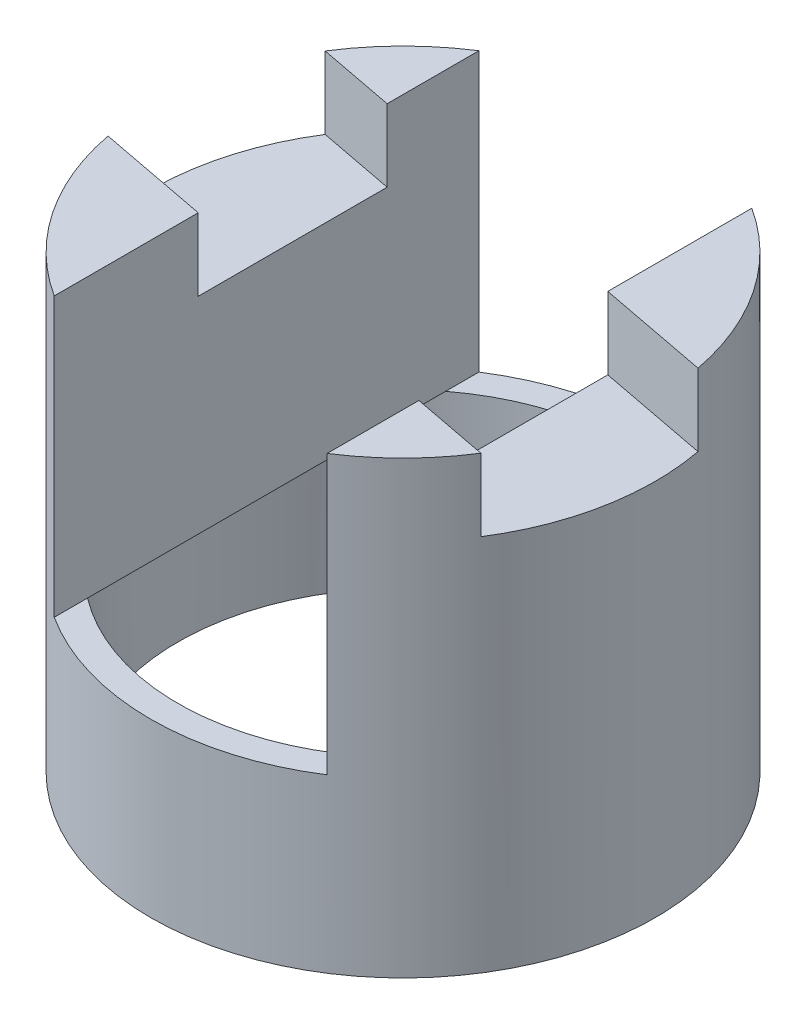
ISO-10303-21;
HEADER;
FILE_DESCRIPTION(('STEP AP214'),'2;1');
FILE_NAME('part.step','',(''),(''),'','','');
FILE_SCHEMA(('AUTOMOTIVE_DESIGN { 1 0 10303 214 1 1 1 1 }'));
ENDSEC;
DATA;
#1=APPLICATION_CONTEXT('core data for automotive mechanical design processes');
#2=APPLICATION_PROTOCOL_DEFINITION('international standard','automotive_design',2000,#1);
#3=PRODUCT_CONTEXT('',#1,'mechanical');
#4=PRODUCT('Part','Part','',(#3));
#5=PRODUCT_RELATED_PRODUCT_CATEGORY('part','',(#4));
#6=PRODUCT_DEFINITION_FORMATION('','',#4);
#7=PRODUCT_DEFINITION_CONTEXT('part definition',#1,'design');
#8=PRODUCT_DEFINITION('design','',#6,#7);
#9=PRODUCT_DEFINITION_SHAPE('','',#8);
#10=(LENGTH_UNIT() NAMED_UNIT(*) SI_UNIT(.MILLI.,.METRE.));
#11=(NAMED_UNIT(*) PLANE_ANGLE_UNIT() SI_UNIT($,.RADIAN.));
#12=(NAMED_UNIT(*) SI_UNIT($,.STERADIAN.) SOLID_ANGLE_UNIT());
#13=UNCERTAINTY_MEASURE_WITH_UNIT(LENGTH_MEASURE(1.E-05),#10,'distance_accuracy_value','');
#14=(GEOMETRIC_REPRESENTATION_CONTEXT(3) GLOBAL_UNCERTAINTY_ASSIGNED_CONTEXT((#13)) GLOBAL_UNIT_ASSIGNED_CONTEXT((#10,
#11,#12)) REPRESENTATION_CONTEXT('',''));
#15=CARTESIAN_POINT('',(0.,0.,0.));
#16=DIRECTION('',(0.,0.,1.));
#17=DIRECTION('',(1.,0.,0.));
#18=AXIS2_PLACEMENT_3D('',#15,#16,#17);
#19=CARTESIAN_POINT('',(0.,33.,0.));
#20=DIRECTION('',(0.,1.,0.));
#21=DIRECTION('',(0.,0.,1.));
#22=AXIS2_PLACEMENT_3D('',#19,#20,#21);
#23=PLANE('',#22);
#24=CARTESIAN_POINT('',(0.,33.,0.));
#25=DIRECTION('',(0.,1.,0.));
#26=DIRECTION('',(0.,0.,1.));
#27=AXIS2_PLACEMENT_3D('',#24,#25,#26);
#28=CIRCLE('',#27,18.5);
#29=CARTESIAN_POINT('',(10.,33.,15.5643824162734));
#30=VERTEX_POINT('',#29);
#31=CARTESIAN_POINT('',(15.619948821732,33.,9.91298132785852));
#32=VERTEX_POINT('',#31);
#33=EDGE_CURVE('E214',#30,#32,#28,.T.);
#34=ORIENTED_EDGE('',*,*,#33,.T.);
#35=DIRECTION('',(-0.982172602731088,0.,-0.18798132472254));
#36=VECTOR('',#35,1.);
#37=CARTESIAN_POINT('',(-1.27827300811327,33.,6.6787736985714));
#38=LINE('',#37,#36);
#39=CARTESIAN_POINT('',(10.,33.,8.83736038155595));
#40=VERTEX_POINT('',#39);
#41=EDGE_CURVE('E160',#32,#40,#38,.T.);
#42=ORIENTED_EDGE('',*,*,#41,.T.);
#43=DIRECTION('',(0.,0.,-1.));
#44=VECTOR('',#43,1.);
#45=CARTESIAN_POINT('',(10.,33.,0.));
#46=LINE('',#45,#44);
#47=EDGE_CURVE('E226',#30,#40,#46,.T.);
#48=ORIENTED_EDGE('',*,*,#47,.F.);
#49=EDGE_LOOP('',(#34,#42,#48));
#50=FACE_BOUND('',#49,.T.);
#51=ADVANCED_FACE('F33',(#50),#23,.T.);
#52=DIRECTION('',(0.,0.,1.));
#53=VECTOR('',#52,1.);
#54=CARTESIAN_POINT('',(-10.,33.,0.));
#55=LINE('',#54,#53);
#56=CARTESIAN_POINT('',(-10.,33.,5.00949297414043));
#57=VERTEX_POINT('',#56);
#58=CARTESIAN_POINT('',(-10.,33.,15.5643824162734));
#59=VERTEX_POINT('',#58);
#60=EDGE_CURVE('E217',#57,#59,#55,.T.);
#61=ORIENTED_EDGE('',*,*,#60,.F.);
#62=DIRECTION('',(-0.982172602731088,0.,-0.18798132472254));
#63=VECTOR('',#62,1.);
#64=CARTESIAN_POINT('',(-1.27827300811327,33.,6.6787736985714));
#65=LINE('',#64,#63);
#66=CARTESIAN_POINT('',(-18.1764948379586,33.,3.44456606928428));
#67=VERTEX_POINT('',#66);
#68=EDGE_CURVE('E56',#57,#67,#65,.T.);
#69=ORIENTED_EDGE('',*,*,#68,.T.);
#70=EDGE_CURVE('E157',#67,#59,#28,.T.);
#71=ORIENTED_EDGE('',*,*,#70,.T.);
#72=EDGE_LOOP('',(#61,#69,#71));
#73=FACE_BOUND('',#72,.T.);
#74=ADVANCED_FACE('F296',(#73),#23,.T.);
#75=CARTESIAN_POINT('',(0.,12.6,0.));
#76=DIRECTION('',(0.,-1.,0.));
#77=DIRECTION('',(0.,0.,-1.));
#78=AXIS2_PLACEMENT_3D('',#75,#76,#77);
#79=PLANE('',#78);
#80=CARTESIAN_POINT('',(0.,12.6,0.));
#81=DIRECTION('',(0.,-1.,0.));
#82=DIRECTION('',(0.,0.,-1.));
#83=AXIS2_PLACEMENT_3D('',#80,#81,#82);
#84=CIRCLE('',#83,16.5);
#85=CARTESIAN_POINT('',(-10.,12.6,13.1244047484067));
#86=VERTEX_POINT('',#85);
#87=CARTESIAN_POINT('',(-10.,12.6,-13.1244047484067));
#88=VERTEX_POINT('',#87);
#89=EDGE_CURVE('E209',#86,#88,#84,.T.);
#90=ORIENTED_EDGE('',*,*,#89,.T.);
#91=DIRECTION('',(0.,0.,1.));
#92=VECTOR('',#91,1.);
#93=CARTESIAN_POINT('',(-10.,12.6,24.6746754841758));
#94=LINE('',#93,#92);
#95=EDGE_CURVE('E187',#88,#86,#94,.T.);
#96=ORIENTED_EDGE('',*,*,#95,.T.);
#97=EDGE_LOOP('',(#90,#96));
#98=FACE_BOUND('',#97,.T.);
#99=ADVANCED_FACE('F271',(#98),#79,.T.);
#100=CARTESIAN_POINT('',(10.,12.6,-13.1244047484067));
#101=VERTEX_POINT('',#100);
#102=CARTESIAN_POINT('',(10.,12.6,13.1244047484067));
#103=VERTEX_POINT('',#102);
#104=EDGE_CURVE('E205',#101,#103,#84,.T.);
#105=ORIENTED_EDGE('',*,*,#104,.T.);
#106=DIRECTION('',(0.,0.,-1.));
#107=VECTOR('',#106,1.);
#108=CARTESIAN_POINT('',(10.,12.6,24.6746754841758));
#109=LINE('',#108,#107);
#110=EDGE_CURVE('E192',#103,#101,#109,.T.);
#111=ORIENTED_EDGE('',*,*,#110,.T.);
#112=EDGE_LOOP('',(#105,#111));
#113=FACE_BOUND('',#112,.T.);
#114=ADVANCED_FACE('F281',(#113),#79,.T.);
#115=DIRECTION('',(-0.982172602731088,0.,-0.18798132472254));
#116=VECTOR('',#115,1.);
#117=CARTESIAN_POINT('',(1.27827300811327,33.,-6.6787736985714));
#118=LINE('',#117,#116);
#119=CARTESIAN_POINT('',(18.1764948379586,33.,-3.44456606928428));
#120=VERTEX_POINT('',#119);
#121=CARTESIAN_POINT('',(10.,33.,-5.00949297414043));
#122=VERTEX_POINT('',#121);
#123=EDGE_CURVE('E175',#120,#122,#118,.T.);
#124=ORIENTED_EDGE('',*,*,#123,.F.);
#125=CARTESIAN_POINT('',(10.,33.,-15.5643824162734));
#126=VERTEX_POINT('',#125);
#127=EDGE_CURVE('E218',#120,#126,#28,.T.);
#128=ORIENTED_EDGE('',*,*,#127,.T.);
#129=EDGE_CURVE('E225',#122,#126,#46,.T.);
#130=ORIENTED_EDGE('',*,*,#129,.F.);
#131=EDGE_LOOP('',(#124,#128,#130));
#132=FACE_BOUND('',#131,.T.);
#133=ADVANCED_FACE('F253',(#132),#23,.T.);
#134=CARTESIAN_POINT('',(0.,33.,0.));
#135=DIRECTION('',(0.,-1.,0.));
#136=DIRECTION('',(0.,0.,-1.));
#137=AXIS2_PLACEMENT_3D('',#134,#135,#136);
#138=CYLINDRICAL_SURFACE('',#137,18.5);
#139=ORIENTED_EDGE('',*,*,#127,.F.);
#140=DIRECTION('',(0.,-1.,0.));
#141=VECTOR('',#140,1.);
#142=CARTESIAN_POINT('',(18.1764948379586,33.,-3.44456606928427));
#143=LINE('',#142,#141);
#144=CARTESIAN_POINT('',(18.1764948379586,27.7,-3.44456606928428));
#145=VERTEX_POINT('',#144);
#146=EDGE_CURVE('E177',#120,#145,#143,.T.);
#147=ORIENTED_EDGE('',*,*,#146,.T.);
#148=CARTESIAN_POINT('',(0.,27.7,0.));
#149=DIRECTION('',(0.,-1.,0.));
#150=DIRECTION('',(1.,0.,0.));
#151=AXIS2_PLACEMENT_3D('',#148,#149,#150);
#152=CIRCLE('',#151,18.5);
#153=CARTESIAN_POINT('',(15.619948821732,27.7,9.91298132785852));
#154=VERTEX_POINT('',#153);
#155=EDGE_CURVE('E146',#145,#154,#152,.T.);
#156=ORIENTED_EDGE('',*,*,#155,.T.);
#157=DIRECTION('',(0.,-1.,0.));
#158=VECTOR('',#157,1.);
#159=CARTESIAN_POINT('',(15.619948821732,33.,9.91298132785852));
#160=LINE('',#159,#158);
#161=EDGE_CURVE('E166',#32,#154,#160,.T.);
#162=ORIENTED_EDGE('',*,*,#161,.F.);
#163=ORIENTED_EDGE('',*,*,#33,.F.);
#164=DIRECTION('',(0.,-1.,0.));
#165=VECTOR('',#164,1.);
#166=CARTESIAN_POINT('',(10.,33.,15.5643824162734));
#167=LINE('',#166,#165);
#168=CARTESIAN_POINT('',(10.,12.6,15.5643824162734));
#169=VERTEX_POINT('',#168);
#170=EDGE_CURVE('E201',#30,#169,#167,.T.);
#171=ORIENTED_EDGE('',*,*,#170,.T.);
#172=CARTESIAN_POINT('',(0.,12.6,0.));
#173=DIRECTION('',(0.,-1.,0.));
#174=DIRECTION('',(0.,0.,-1.));
#175=AXIS2_PLACEMENT_3D('',#172,#173,#174);
#176=CIRCLE('',#175,18.5);
#177=CARTESIAN_POINT('',(-10.,12.6,15.5643824162734));
#178=VERTEX_POINT('',#177);
#179=EDGE_CURVE('E229',#169,#178,#176,.T.);
#180=ORIENTED_EDGE('',*,*,#179,.T.);
#181=DIRECTION('',(0.,-1.,0.));
#182=VECTOR('',#181,1.);
#183=CARTESIAN_POINT('',(-10.,33.,15.5643824162734));
#184=LINE('',#183,#182);
#185=EDGE_CURVE('E193',#178,#59,#184,.F.);
#186=ORIENTED_EDGE('',*,*,#185,.T.);
#187=ORIENTED_EDGE('',*,*,#70,.F.);
#188=DIRECTION('',(0.,-1.,0.));
#189=VECTOR('',#188,1.);
#190=CARTESIAN_POINT('',(-18.1764948379586,33.,3.44456606928428));
#191=LINE('',#190,#189);
#192=CARTESIAN_POINT('',(-18.1764948379586,27.7,3.44456606928428));
#193=VERTEX_POINT('',#192);
#194=EDGE_CURVE('E149',#193,#67,#191,.F.);
#195=ORIENTED_EDGE('',*,*,#194,.F.);
#196=CARTESIAN_POINT('',(-15.619948821732,27.7,-9.91298132785852));
#197=VERTEX_POINT('',#196);
#198=EDGE_CURVE('E135',#193,#197,#152,.T.);
#199=ORIENTED_EDGE('',*,*,#198,.T.);
#200=DIRECTION('',(0.,-1.,0.));
#201=VECTOR('',#200,1.);
#202=CARTESIAN_POINT('',(-15.619948821732,33.,-9.91298132785852));
#203=LINE('',#202,#201);
#204=CARTESIAN_POINT('',(-15.619948821732,33.,-9.91298132785852));
#205=VERTEX_POINT('',#204);
#206=EDGE_CURVE('E170',#197,#205,#203,.F.);
#207=ORIENTED_EDGE('',*,*,#206,.T.);
#208=CARTESIAN_POINT('',(-10.,33.,-15.5643824162734));
#209=VERTEX_POINT('',#208);
#210=EDGE_CURVE('E219',#209,#205,#28,.T.);
#211=ORIENTED_EDGE('',*,*,#210,.F.);
#212=DIRECTION('',(0.,-1.,0.));
#213=VECTOR('',#212,1.);
#214=CARTESIAN_POINT('',(-10.,33.,-15.5643824162734));
#215=LINE('',#214,#213);
#216=CARTESIAN_POINT('',(-10.,12.6,-15.5643824162734));
#217=VERTEX_POINT('',#216);
#218=EDGE_CURVE('E195',#209,#217,#215,.T.);
#219=ORIENTED_EDGE('',*,*,#218,.T.);
#220=CARTESIAN_POINT('',(10.,12.6,-15.5643824162734));
#221=VERTEX_POINT('',#220);
#222=EDGE_CURVE('E232',#217,#221,#176,.T.);
#223=ORIENTED_EDGE('',*,*,#222,.T.);
#224=DIRECTION('',(0.,-1.,0.));
#225=VECTOR('',#224,1.);
#226=CARTESIAN_POINT('',(10.,33.,-15.5643824162734));
#227=LINE('',#226,#225);
#228=EDGE_CURVE('E198',#221,#126,#227,.F.);
#229=ORIENTED_EDGE('',*,*,#228,.T.);
#230=EDGE_LOOP('',(#139,#147,#156,#162,#163,#171,#180,#186,#187,#195,#199,#207,#211,#219,#223,#229));
#231=FACE_BOUND('',#230,.T.);
#232=CARTESIAN_POINT('',(0.,0.,0.));
#233=DIRECTION('',(0.,1.,0.));
#234=DIRECTION('',(0.,0.,1.));
#235=AXIS2_PLACEMENT_3D('',#232,#233,#234);
#236=CIRCLE('',#235,18.5);
#237=CARTESIAN_POINT('',(0.,0.,18.5));
#238=VERTEX_POINT('',#237);
#239=EDGE_CURVE('E208',#238,#238,#236,.T.);
#240=ORIENTED_EDGE('',*,*,#239,.T.);
#241=EDGE_LOOP('',(#240));
#242=FACE_BOUND('',#241,.T.);
#243=ADVANCED_FACE('F35',(#231,#242),#138,.T.);
#244=DIRECTION('',(-0.982172602731088,0.,-0.18798132472254));
#245=VECTOR('',#244,1.);
#246=CARTESIAN_POINT('',(1.27827300811327,33.,-6.6787736985714));
#247=LINE('',#246,#245);
#248=CARTESIAN_POINT('',(-10.,33.,-8.83736038155595));
#249=VERTEX_POINT('',#248);
#250=EDGE_CURVE('E168',#249,#205,#247,.T.);
#251=ORIENTED_EDGE('',*,*,#250,.F.);
#252=EDGE_CURVE('E222',#209,#249,#55,.T.);
#253=ORIENTED_EDGE('',*,*,#252,.F.);
#254=ORIENTED_EDGE('',*,*,#210,.T.);
#255=EDGE_LOOP('',(#251,#253,#254));
#256=FACE_BOUND('',#255,.T.);
#257=ADVANCED_FACE('F298',(#256),#23,.T.);
#258=CARTESIAN_POINT('',(0.,0.,0.));
#259=DIRECTION('',(0.,1.,0.));
#260=DIRECTION('',(0.,0.,1.));
#261=AXIS2_PLACEMENT_3D('',#258,#259,#260);
#262=PLANE('',#261);
#263=CARTESIAN_POINT('',(0.,0.,0.));
#264=DIRECTION('',(0.,-1.,0.));
#265=DIRECTION('',(0.,0.,-1.));
#266=AXIS2_PLACEMENT_3D('',#263,#264,#265);
#267=CIRCLE('',#266,16.5);
#268=CARTESIAN_POINT('',(0.,0.,-16.5));
#269=VERTEX_POINT('',#268);
#270=EDGE_CURVE('E210',#269,#269,#267,.T.);
#271=ORIENTED_EDGE('',*,*,#270,.F.);
#272=EDGE_LOOP('',(#271));
#273=FACE_BOUND('',#272,.T.);
#274=ORIENTED_EDGE('',*,*,#239,.F.);
#275=EDGE_LOOP('',(#274));
#276=FACE_BOUND('',#275,.T.);
#277=ADVANCED_FACE('F305',(#273,#276),#262,.F.);
#278=CARTESIAN_POINT('',(0.,12.6,0.));
#279=DIRECTION('',(0.,-1.,0.));
#280=DIRECTION('',(0.,0.,-1.));
#281=AXIS2_PLACEMENT_3D('',#278,#279,#280);
#282=CYLINDRICAL_SURFACE('',#281,16.5);
#283=ORIENTED_EDGE('',*,*,#104,.F.);
#284=EDGE_CURVE('E204',#88,#101,#84,.T.);
#285=ORIENTED_EDGE('',*,*,#284,.F.);
#286=ORIENTED_EDGE('',*,*,#89,.F.);
#287=EDGE_CURVE('E213',#103,#86,#84,.T.);
#288=ORIENTED_EDGE('',*,*,#287,.F.);
#289=EDGE_LOOP('',(#283,#285,#286,#288));
#290=FACE_BOUND('',#289,.T.);
#291=ORIENTED_EDGE('',*,*,#270,.T.);
#292=EDGE_LOOP('',(#291));
#293=FACE_BOUND('',#292,.T.);
#294=ADVANCED_FACE('F275',(#290,#293),#282,.F.);
#295=CARTESIAN_POINT('',(0.,12.6,0.));
#296=DIRECTION('',(0.,-1.,0.));
#297=DIRECTION('',(0.,0.,-1.));
#298=AXIS2_PLACEMENT_3D('',#295,#296,#297);
#299=PLANE('',#298);
#300=ORIENTED_EDGE('',*,*,#287,.T.);
#301=EDGE_CURVE('E184',#86,#178,#94,.T.);
#302=ORIENTED_EDGE('',*,*,#301,.T.);
#303=ORIENTED_EDGE('',*,*,#179,.F.);
#304=EDGE_CURVE('E188',#169,#103,#109,.T.);
#305=ORIENTED_EDGE('',*,*,#304,.T.);
#306=EDGE_LOOP('',(#300,#302,#303,#305));
#307=FACE_BOUND('',#306,.T.);
#308=ADVANCED_FACE('F283',(#307),#299,.F.);
#309=ORIENTED_EDGE('',*,*,#284,.T.);
#310=EDGE_CURVE('E145',#101,#221,#109,.T.);
#311=ORIENTED_EDGE('',*,*,#310,.T.);
#312=ORIENTED_EDGE('',*,*,#222,.F.);
#313=EDGE_CURVE('E189',#217,#88,#94,.T.);
#314=ORIENTED_EDGE('',*,*,#313,.T.);
#315=EDGE_LOOP('',(#309,#311,#312,#314));
#316=FACE_BOUND('',#315,.T.);
#317=ADVANCED_FACE('F263',(#316),#299,.F.);
#318=CARTESIAN_POINT('',(10.,-40.6480839185557,24.6746754841758));
#319=DIRECTION('',(1.,0.,0.));
#320=DIRECTION('',(0.,0.,-1.));
#321=AXIS2_PLACEMENT_3D('',#318,#319,#320);
#322=PLANE('',#321);
#323=DIRECTION('',(0.,0.,-1.));
#324=VECTOR('',#323,1.);
#325=CARTESIAN_POINT('',(10.,27.7,24.6746754841758));
#326=LINE('',#325,#324);
#327=CARTESIAN_POINT('',(10.,27.7,8.83736038155595));
#328=VERTEX_POINT('',#327);
#329=CARTESIAN_POINT('',(10.,27.7,-5.00949297414042));
#330=VERTEX_POINT('',#329);
#331=EDGE_CURVE('E180',#328,#330,#326,.T.);
#332=ORIENTED_EDGE('',*,*,#331,.T.);
#333=DIRECTION('',(0.,1.,0.));
#334=VECTOR('',#333,1.);
#335=CARTESIAN_POINT('',(10.,-40.6480839185557,-5.00949297414043));
#336=LINE('',#335,#334);
#337=EDGE_CURVE('E172',#330,#122,#336,.T.);
#338=ORIENTED_EDGE('',*,*,#337,.T.);
#339=ORIENTED_EDGE('',*,*,#129,.T.);
#340=ORIENTED_EDGE('',*,*,#228,.F.);
#341=ORIENTED_EDGE('',*,*,#310,.F.);
#342=ORIENTED_EDGE('',*,*,#110,.F.);
#343=ORIENTED_EDGE('',*,*,#304,.F.);
#344=ORIENTED_EDGE('',*,*,#170,.F.);
#345=ORIENTED_EDGE('',*,*,#47,.T.);
#346=DIRECTION('',(0.,1.,0.));
#347=VECTOR('',#346,1.);
#348=CARTESIAN_POINT('',(10.,-40.6480839185557,8.83736038155595));
#349=LINE('',#348,#347);
#350=EDGE_CURVE('E158',#328,#40,#349,.T.);
#351=ORIENTED_EDGE('',*,*,#350,.F.);
#352=EDGE_LOOP('',(#332,#338,#339,#340,#341,#342,#343,#344,#345,#351));
#353=FACE_BOUND('',#352,.T.);
#354=ADVANCED_FACE('F256',(#353),#322,.F.);
#355=CARTESIAN_POINT('',(-10.,-40.6480839185557,24.6746754841758));
#356=DIRECTION('',(-1.,0.,0.));
#357=DIRECTION('',(0.,0.,1.));
#358=AXIS2_PLACEMENT_3D('',#355,#356,#357);
#359=PLANE('',#358);
#360=ORIENTED_EDGE('',*,*,#252,.T.);
#361=DIRECTION('',(0.,-1.,0.));
#362=VECTOR('',#361,1.);
#363=CARTESIAN_POINT('',(-10.,-40.6480839185557,-8.83736038155595));
#364=LINE('',#363,#362);
#365=CARTESIAN_POINT('',(-10.,27.7,-8.83736038155595));
#366=VERTEX_POINT('',#365);
#367=EDGE_CURVE('E11',#249,#366,#364,.T.);
#368=ORIENTED_EDGE('',*,*,#367,.T.);
#369=DIRECTION('',(0.,0.,1.));
#370=VECTOR('',#369,1.);
#371=CARTESIAN_POINT('',(-10.,27.7,24.6746754841758));
#372=LINE('',#371,#370);
#373=CARTESIAN_POINT('',(-10.,27.7,5.00949297414042));
#374=VERTEX_POINT('',#373);
#375=EDGE_CURVE('E41',#366,#374,#372,.T.);
#376=ORIENTED_EDGE('',*,*,#375,.T.);
#377=DIRECTION('',(0.,-1.,0.));
#378=VECTOR('',#377,1.);
#379=CARTESIAN_POINT('',(-10.,-40.6480839185557,5.00949297414043));
#380=LINE('',#379,#378);
#381=EDGE_CURVE('E150',#57,#374,#380,.T.);
#382=ORIENTED_EDGE('',*,*,#381,.F.);
#383=ORIENTED_EDGE('',*,*,#60,.T.);
#384=ORIENTED_EDGE('',*,*,#185,.F.);
#385=ORIENTED_EDGE('',*,*,#301,.F.);
#386=ORIENTED_EDGE('',*,*,#95,.F.);
#387=ORIENTED_EDGE('',*,*,#313,.F.);
#388=ORIENTED_EDGE('',*,*,#218,.F.);
#389=EDGE_LOOP('',(#360,#368,#376,#382,#383,#384,#385,#386,#387,#388));
#390=FACE_BOUND('',#389,.T.);
#391=ADVANCED_FACE('F234',(#390),#359,.F.);
#392=CARTESIAN_POINT('',(1.27827300811327,0.,-6.6787736985714));
#393=DIRECTION('',(0.18798132472254,0.,-0.982172602731088));
#394=DIRECTION('',(-0.982172602731088,0.,-0.18798132472254));
#395=AXIS2_PLACEMENT_3D('',#392,#393,#394);
#396=PLANE('',#395);
#397=DIRECTION('',(0.982172602731088,0.,0.18798132472254));
#398=VECTOR('',#397,1.);
#399=CARTESIAN_POINT('',(-27.5096985608805,27.7,-12.1886006032992));
#400=LINE('',#399,#398);
#401=EDGE_CURVE('E141',#197,#366,#400,.T.);
#402=ORIENTED_EDGE('',*,*,#401,.T.);
#403=ORIENTED_EDGE('',*,*,#367,.F.);
#404=ORIENTED_EDGE('',*,*,#250,.T.);
#405=ORIENTED_EDGE('',*,*,#206,.F.);
#406=EDGE_LOOP('',(#402,#403,#404,#405));
#407=FACE_BOUND('',#406,.T.);
#408=ADVANCED_FACE('F238',(#407),#396,.F.);
#409=CARTESIAN_POINT('',(-1.27827300811327,0.,6.6787736985714));
#410=DIRECTION('',(0.18798132472254,0.,-0.982172602731088));
#411=DIRECTION('',(-0.982172602731088,0.,-0.18798132472254));
#412=AXIS2_PLACEMENT_3D('',#409,#410,#411);
#413=PLANE('',#412);
#414=ORIENTED_EDGE('',*,*,#194,.T.);
#415=ORIENTED_EDGE('',*,*,#68,.F.);
#416=ORIENTED_EDGE('',*,*,#381,.T.);
#417=DIRECTION('',(0.982172602731088,0.,0.18798132472254));
#418=VECTOR('',#417,1.);
#419=CARTESIAN_POINT('',(-30.066244577107,27.7,1.1689467938436));
#420=LINE('',#419,#418);
#421=EDGE_CURVE('E138',#193,#374,#420,.T.);
#422=ORIENTED_EDGE('',*,*,#421,.F.);
#423=EDGE_LOOP('',(#414,#415,#416,#422));
#424=FACE_BOUND('',#423,.T.);
#425=ADVANCED_FACE('F148',(#424),#413,.T.);
#426=CARTESIAN_POINT('',(-27.5096985608805,27.7,-12.1886006032992));
#427=DIRECTION('',(0.,-1.,0.));
#428=DIRECTION('',(1.,0.,0.));
#429=AXIS2_PLACEMENT_3D('',#426,#427,#428);
#430=PLANE('',#429);
#431=ORIENTED_EDGE('',*,*,#421,.T.);
#432=ORIENTED_EDGE('',*,*,#375,.F.);
#433=ORIENTED_EDGE('',*,*,#401,.F.);
#434=ORIENTED_EDGE('',*,*,#198,.F.);
#435=EDGE_LOOP('',(#431,#432,#433,#434));
#436=FACE_BOUND('',#435,.T.);
#437=ADVANCED_FACE('F137',(#436),#430,.F.);
#438=EDGE_CURVE('E151',#330,#145,#400,.T.);
#439=ORIENTED_EDGE('',*,*,#438,.F.);
#440=ORIENTED_EDGE('',*,*,#331,.F.);
#441=EDGE_CURVE('E48',#328,#154,#420,.T.);
#442=ORIENTED_EDGE('',*,*,#441,.T.);
#443=ORIENTED_EDGE('',*,*,#155,.F.);
#444=EDGE_LOOP('',(#439,#440,#442,#443));
#445=FACE_BOUND('',#444,.T.);
#446=ADVANCED_FACE('F244',(#445),#430,.F.);
#447=ORIENTED_EDGE('',*,*,#123,.T.);
#448=ORIENTED_EDGE('',*,*,#337,.F.);
#449=ORIENTED_EDGE('',*,*,#438,.T.);
#450=ORIENTED_EDGE('',*,*,#146,.F.);
#451=EDGE_LOOP('',(#447,#448,#449,#450));
#452=FACE_BOUND('',#451,.T.);
#453=ADVANCED_FACE('F250',(#452),#396,.F.);
#454=ORIENTED_EDGE('',*,*,#161,.T.);
#455=ORIENTED_EDGE('',*,*,#441,.F.);
#456=ORIENTED_EDGE('',*,*,#350,.T.);
#457=ORIENTED_EDGE('',*,*,#41,.F.);
#458=EDGE_LOOP('',(#454,#455,#456,#457));
#459=FACE_BOUND('',#458,.T.);
#460=ADVANCED_FACE('F286',(#459),#413,.T.);
#461=CLOSED_SHELL('',(#51,#74,#99,#114,#133,#243,#257,#277,#294,#308,#317,#354,#391,#408,#425,
#437,#446,#453,#460));
#462=MANIFOLD_SOLID_BREP('B2',#461);
#463=ADVANCED_BREP_SHAPE_REPRESENTATION('',(#18,#462),#14);
#464=SHAPE_DEFINITION_REPRESENTATION(#9,#463);
ENDSEC;
END-ISO-10303-21;
